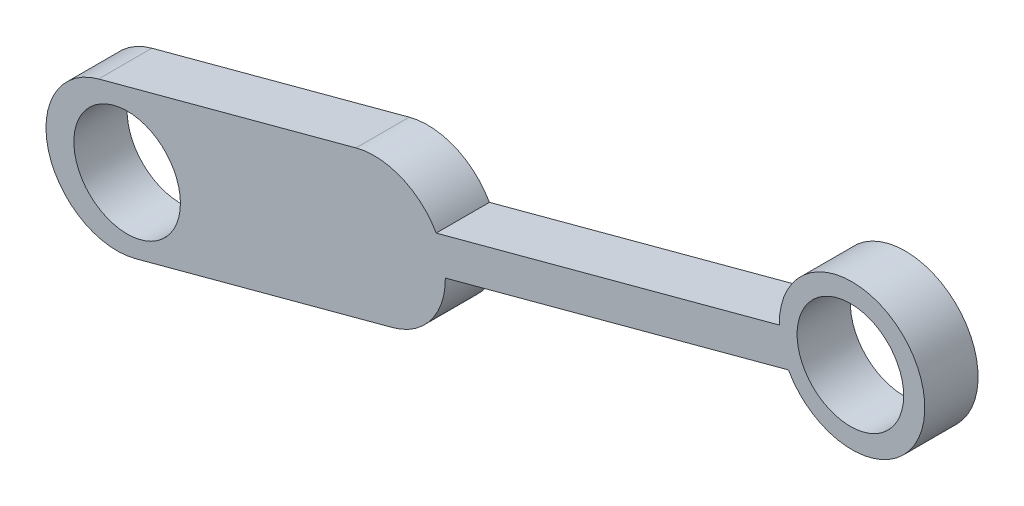
ISO-10303-21;
HEADER;
FILE_DESCRIPTION(('STEP AP214'),'2;1');
FILE_NAME('part.step','',(''),(''),'','','');
FILE_SCHEMA(('AUTOMOTIVE_DESIGN { 1 0 10303 214 1 1 1 1 }'));
ENDSEC;
DATA;
#1=APPLICATION_CONTEXT('core data for automotive mechanical design processes');
#2=APPLICATION_PROTOCOL_DEFINITION('international standard','automotive_design',2000,#1);
#3=PRODUCT_CONTEXT('',#1,'mechanical');
#4=PRODUCT('Part','Part','',(#3));
#5=PRODUCT_RELATED_PRODUCT_CATEGORY('part','',(#4));
#6=PRODUCT_DEFINITION_FORMATION('','',#4);
#7=PRODUCT_DEFINITION_CONTEXT('part definition',#1,'design');
#8=PRODUCT_DEFINITION('design','',#6,#7);
#9=PRODUCT_DEFINITION_SHAPE('','',#8);
#10=(LENGTH_UNIT() NAMED_UNIT(*) SI_UNIT(.MILLI.,.METRE.));
#11=(NAMED_UNIT(*) PLANE_ANGLE_UNIT() SI_UNIT($,.RADIAN.));
#12=(NAMED_UNIT(*) SI_UNIT($,.STERADIAN.) SOLID_ANGLE_UNIT());
#13=UNCERTAINTY_MEASURE_WITH_UNIT(LENGTH_MEASURE(1.E-05),#10,'distance_accuracy_value','');
#14=(GEOMETRIC_REPRESENTATION_CONTEXT(3) GLOBAL_UNCERTAINTY_ASSIGNED_CONTEXT((#13)) GLOBAL_UNIT_ASSIGNED_CONTEXT((#10,
#11,#12)) REPRESENTATION_CONTEXT('',''));
#15=CARTESIAN_POINT('',(0.,0.,0.));
#16=DIRECTION('',(0.,0.,1.));
#17=DIRECTION('',(1.,0.,0.));
#18=AXIS2_PLACEMENT_3D('',#15,#16,#17);
#19=CARTESIAN_POINT('',(-111.320079247921,34.3042255189022,3.));
#20=DIRECTION('',(-0.258819045102522,0.965925826289068,0.));
#21=DIRECTION('',(-0.965925826289068,-0.258819045102522,0.));
#22=AXIS2_PLACEMENT_3D('',#19,#20,#21);
#23=PLANE('',#22);
#24=DIRECTION('',(0.965925826289068,0.258819045102522,0.));
#25=VECTOR('',#24,1.);
#26=CARTESIAN_POINT('',(-111.320079247921,34.3042255189022,0.));
#27=LINE('',#26,#25);
#28=CARTESIAN_POINT('',(-111.320079247921,34.3042255189022,0.));
#29=VERTEX_POINT('',#28);
#30=CARTESIAN_POINT('',(-92.0015627221402,39.4806064209526,0.));
#31=VERTEX_POINT('',#30);
#32=EDGE_CURVE('E128',#29,#31,#27,.T.);
#33=ORIENTED_EDGE('',*,*,#32,.T.);
#34=DIRECTION('',(0.,0.,-1.));
#35=VECTOR('',#34,1.);
#36=CARTESIAN_POINT('',(-92.0015627221402,39.4806064209526,3.));
#37=LINE('',#36,#35);
#38=CARTESIAN_POINT('',(-92.0015627221402,39.4806064209526,3.));
#39=VERTEX_POINT('',#38);
#40=EDGE_CURVE('E11',#39,#31,#37,.T.);
#41=ORIENTED_EDGE('',*,*,#40,.F.);
#42=DIRECTION('',(0.965925826289068,0.258819045102522,0.));
#43=VECTOR('',#42,1.);
#44=CARTESIAN_POINT('',(-111.320079247921,34.3042255189022,3.));
#45=LINE('',#44,#43);
#46=CARTESIAN_POINT('',(-111.320079247921,34.3042255189022,3.));
#47=VERTEX_POINT('',#46);
#48=EDGE_CURVE('E147',#47,#39,#45,.T.);
#49=ORIENTED_EDGE('',*,*,#48,.F.);
#50=DIRECTION('',(0.,0.,-1.));
#51=VECTOR('',#50,1.);
#52=CARTESIAN_POINT('',(-111.320079247921,34.3042255189022,3.));
#53=LINE('',#52,#51);
#54=EDGE_CURVE('E124',#47,#29,#53,.T.);
#55=ORIENTED_EDGE('',*,*,#54,.T.);
#56=EDGE_LOOP('',(#33,#41,#49,#55));
#57=FACE_BOUND('',#56,.T.);
#58=ADVANCED_FACE('F33',(#57),#23,.F.);
#59=CARTESIAN_POINT('',(-88.4217741135421,41.4750840681107,3.));
#60=DIRECTION('',(0.,0.,-1.));
#61=DIRECTION('',(-1.,0.,0.));
#62=AXIS2_PLACEMENT_3D('',#59,#60,#61);
#63=CYLINDRICAL_SURFACE('',#62,4.09790526577442);
#64=CARTESIAN_POINT('',(-88.4217741135421,41.4750840681107,0.));
#65=DIRECTION('',(0.,0.,1.));
#66=DIRECTION('',(1.,0.,0.));
#67=AXIS2_PLACEMENT_3D('',#64,#65,#66);
#68=CIRCLE('',#67,4.09790526577442);
#69=CARTESIAN_POINT('',(-92.5192008123452,41.4124580735308,0.));
#70=VERTEX_POINT('',#69);
#71=EDGE_CURVE('E131',#31,#70,#68,.T.);
#72=ORIENTED_EDGE('',*,*,#71,.T.);
#73=DIRECTION('',(0.,0.,-1.));
#74=VECTOR('',#73,1.);
#75=CARTESIAN_POINT('',(-92.5192008123452,41.4124580735308,3.));
#76=LINE('',#75,#74);
#77=CARTESIAN_POINT('',(-92.5192008123452,41.4124580735308,3.));
#78=VERTEX_POINT('',#77);
#79=EDGE_CURVE('E41',#78,#70,#76,.T.);
#80=ORIENTED_EDGE('',*,*,#79,.F.);
#81=CARTESIAN_POINT('',(-88.4217741135421,41.4750840681107,3.));
#82=DIRECTION('',(0.,0.,1.));
#83=DIRECTION('',(1.,0.,0.));
#84=AXIS2_PLACEMENT_3D('',#81,#82,#83);
#85=CIRCLE('',#84,4.09790526577442);
#86=EDGE_CURVE('E92',#39,#78,#85,.T.);
#87=ORIENTED_EDGE('',*,*,#86,.F.);
#88=ORIENTED_EDGE('',*,*,#40,.T.);
#89=EDGE_LOOP('',(#72,#80,#87,#88));
#90=FACE_BOUND('',#89,.T.);
#91=ADVANCED_FACE('F160',(#90),#63,.T.);
#92=CARTESIAN_POINT('',(-111.837717338127,36.2360771714804,3.));
#93=DIRECTION('',(-0.258819045102521,0.965925826289068,0.));
#94=DIRECTION('',(-0.965925826289068,-0.258819045102521,0.));
#95=AXIS2_PLACEMENT_3D('',#92,#93,#94);
#96=PLANE('',#95);
#97=DIRECTION('',(0.965925826289068,0.258819045102521,0.));
#98=VECTOR('',#97,1.);
#99=CARTESIAN_POINT('',(-111.837717338127,36.2360771714804,0.));
#100=LINE('',#99,#98);
#101=CARTESIAN_POINT('',(-111.837717338127,36.2360771714804,0.));
#102=VERTEX_POINT('',#101);
#103=EDGE_CURVE('E135',#102,#70,#100,.T.);
#104=ORIENTED_EDGE('',*,*,#103,.F.);
#105=DIRECTION('',(0.,0.,-1.));
#106=VECTOR('',#105,1.);
#107=CARTESIAN_POINT('',(-111.837717338127,36.2360771714804,3.));
#108=LINE('',#107,#106);
#109=CARTESIAN_POINT('',(-111.837717338127,36.2360771714804,3.));
#110=VERTEX_POINT('',#109);
#111=EDGE_CURVE('E153',#110,#102,#108,.T.);
#112=ORIENTED_EDGE('',*,*,#111,.F.);
#113=DIRECTION('',(0.965925826289068,0.258819045102521,0.));
#114=VECTOR('',#113,1.);
#115=CARTESIAN_POINT('',(-111.837717338127,36.2360771714804,3.));
#116=LINE('',#115,#114);
#117=EDGE_CURVE('E159',#110,#78,#116,.T.);
#118=ORIENTED_EDGE('',*,*,#117,.T.);
#119=ORIENTED_EDGE('',*,*,#79,.T.);
#120=EDGE_LOOP('',(#104,#112,#118,#119));
#121=FACE_BOUND('',#120,.T.);
#122=ADVANCED_FACE('F157',(#121),#96,.T.);
#123=CARTESIAN_POINT('',(-115.319912931913,34.2677494938279,3.));
#124=DIRECTION('',(0.,0.,-1.));
#125=DIRECTION('',(-1.,0.,0.));
#126=AXIS2_PLACEMENT_3D('',#123,#124,#125);
#127=CYLINDRICAL_SURFACE('',#126,4.);
#128=CARTESIAN_POINT('',(-115.319912931913,34.2677494938279,0.));
#129=DIRECTION('',(0.,0.,1.));
#130=DIRECTION('',(1.,0.,0.));
#131=AXIS2_PLACEMENT_3D('',#128,#129,#130);
#132=CIRCLE('',#131,4.);
#133=CARTESIAN_POINT('',(-116.355189112323,38.1314527989842,0.));
#134=VERTEX_POINT('',#133);
#135=EDGE_CURVE('E138',#102,#134,#132,.T.);
#136=ORIENTED_EDGE('',*,*,#135,.T.);
#137=DIRECTION('',(0.,0.,-1.));
#138=VECTOR('',#137,1.);
#139=CARTESIAN_POINT('',(-116.355189112323,38.1314527989842,3.));
#140=LINE('',#139,#138);
#141=CARTESIAN_POINT('',(-116.355189112323,38.1314527989842,3.));
#142=VERTEX_POINT('',#141);
#143=EDGE_CURVE('E151',#142,#134,#140,.T.);
#144=ORIENTED_EDGE('',*,*,#143,.F.);
#145=CARTESIAN_POINT('',(-115.319912931913,34.2677494938279,3.));
#146=DIRECTION('',(0.,0.,1.));
#147=DIRECTION('',(1.,0.,0.));
#148=AXIS2_PLACEMENT_3D('',#145,#146,#147);
#149=CIRCLE('',#148,4.);
#150=EDGE_CURVE('E171',#110,#142,#149,.T.);
#151=ORIENTED_EDGE('',*,*,#150,.F.);
#152=ORIENTED_EDGE('',*,*,#111,.T.);
#153=EDGE_LOOP('',(#136,#144,#151,#152));
#154=FACE_BOUND('',#153,.T.);
#155=ADVANCED_FACE('F169',(#154),#127,.T.);
#156=CARTESIAN_POINT('',(-130.844076506659,34.2491671224463,3.));
#157=DIRECTION('',(-0.258819045102522,0.965925826289068,0.));
#158=DIRECTION('',(-0.965925826289068,-0.258819045102522,0.));
#159=AXIS2_PLACEMENT_3D('',#156,#157,#158);
#160=PLANE('',#159);
#161=DIRECTION('',(0.965925826289068,0.258819045102522,0.));
#162=VECTOR('',#161,1.);
#163=CARTESIAN_POINT('',(-130.844076506659,34.2491671224463,0.));
#164=LINE('',#163,#162);
#165=CARTESIAN_POINT('',(-130.844076506659,34.2491671224463,0.));
#166=VERTEX_POINT('',#165);
#167=EDGE_CURVE('E141',#166,#134,#164,.T.);
#168=ORIENTED_EDGE('',*,*,#167,.F.);
#169=DIRECTION('',(0.,0.,-1.));
#170=VECTOR('',#169,1.);
#171=CARTESIAN_POINT('',(-130.844076506659,34.2491671224463,3.));
#172=LINE('',#171,#170);
#173=CARTESIAN_POINT('',(-130.844076506659,34.2491671224463,3.));
#174=VERTEX_POINT('',#173);
#175=EDGE_CURVE('E119',#174,#166,#172,.T.);
#176=ORIENTED_EDGE('',*,*,#175,.F.);
#177=DIRECTION('',(0.965925826289068,0.258819045102522,0.));
#178=VECTOR('',#177,1.);
#179=CARTESIAN_POINT('',(-130.844076506659,34.2491671224463,3.));
#180=LINE('',#179,#178);
#181=EDGE_CURVE('E112',#174,#142,#180,.T.);
#182=ORIENTED_EDGE('',*,*,#181,.T.);
#183=ORIENTED_EDGE('',*,*,#143,.T.);
#184=EDGE_LOOP('',(#168,#176,#182,#183));
#185=FACE_BOUND('',#184,.T.);
#186=ADVANCED_FACE('F177',(#185),#160,.T.);
#187=CARTESIAN_POINT('',(-129.808800326249,30.38546381729,3.));
#188=DIRECTION('',(0.,0.,-1.));
#189=DIRECTION('',(-1.,0.,0.));
#190=AXIS2_PLACEMENT_3D('',#187,#188,#189);
#191=CYLINDRICAL_SURFACE('',#190,4.00000000000001);
#192=CARTESIAN_POINT('',(-129.808800326249,30.38546381729,0.));
#193=DIRECTION('',(0.,0.,1.));
#194=DIRECTION('',(1.,0.,0.));
#195=AXIS2_PLACEMENT_3D('',#192,#193,#194);
#196=CIRCLE('',#195,4.00000000000001);
#197=CARTESIAN_POINT('',(-128.773524145839,26.5217605121337,0.));
#198=VERTEX_POINT('',#197);
#199=EDGE_CURVE('E118',#166,#198,#196,.T.);
#200=ORIENTED_EDGE('',*,*,#199,.T.);
#201=DIRECTION('',(0.,0.,-1.));
#202=VECTOR('',#201,1.);
#203=CARTESIAN_POINT('',(-128.773524145839,26.5217605121337,3.));
#204=LINE('',#203,#202);
#205=CARTESIAN_POINT('',(-128.773524145839,26.5217605121337,3.));
#206=VERTEX_POINT('',#205);
#207=EDGE_CURVE('E115',#206,#198,#204,.T.);
#208=ORIENTED_EDGE('',*,*,#207,.F.);
#209=CARTESIAN_POINT('',(-129.808800326249,30.38546381729,3.));
#210=DIRECTION('',(0.,0.,1.));
#211=DIRECTION('',(1.,0.,0.));
#212=AXIS2_PLACEMENT_3D('',#209,#210,#211);
#213=CIRCLE('',#212,4.00000000000001);
#214=EDGE_CURVE('E106',#174,#206,#213,.T.);
#215=ORIENTED_EDGE('',*,*,#214,.F.);
#216=ORIENTED_EDGE('',*,*,#175,.T.);
#217=EDGE_LOOP('',(#200,#208,#215,#216));
#218=FACE_BOUND('',#217,.T.);
#219=ADVANCED_FACE('F116',(#218),#191,.T.);
#220=CARTESIAN_POINT('',(-128.773524145839,26.5217605121338,3.));
#221=DIRECTION('',(-0.258819045102519,0.965925826289069,0.));
#222=DIRECTION('',(-0.965925826289069,-0.258819045102519,0.));
#223=AXIS2_PLACEMENT_3D('',#220,#221,#222);
#224=PLANE('',#223);
#225=DIRECTION('',(0.965925826289069,0.258819045102519,0.));
#226=VECTOR('',#225,1.);
#227=CARTESIAN_POINT('',(-128.773524145839,26.5217605121338,0.));
#228=LINE('',#227,#226);
#229=CARTESIAN_POINT('',(-114.284636751503,30.4040461886716,0.));
#230=VERTEX_POINT('',#229);
#231=EDGE_CURVE('E78',#198,#230,#228,.T.);
#232=ORIENTED_EDGE('',*,*,#231,.T.);
#233=DIRECTION('',(0.,0.,-1.));
#234=VECTOR('',#233,1.);
#235=CARTESIAN_POINT('',(-114.284636751503,30.4040461886716,3.));
#236=LINE('',#235,#234);
#237=CARTESIAN_POINT('',(-114.284636751503,30.4040461886716,3.));
#238=VERTEX_POINT('',#237);
#239=EDGE_CURVE('E120',#238,#230,#236,.T.);
#240=ORIENTED_EDGE('',*,*,#239,.F.);
#241=DIRECTION('',(0.965925826289069,0.258819045102519,0.));
#242=VECTOR('',#241,1.);
#243=CARTESIAN_POINT('',(-128.773524145839,26.5217605121338,3.));
#244=LINE('',#243,#242);
#245=EDGE_CURVE('E110',#206,#238,#244,.T.);
#246=ORIENTED_EDGE('',*,*,#245,.F.);
#247=ORIENTED_EDGE('',*,*,#207,.T.);
#248=EDGE_LOOP('',(#232,#240,#246,#247));
#249=FACE_BOUND('',#248,.T.);
#250=ADVANCED_FACE('F122',(#249),#224,.F.);
#251=CARTESIAN_POINT('',(-115.319912931913,34.2677494938279,3.));
#252=DIRECTION('',(0.,0.,-1.));
#253=DIRECTION('',(-1.,0.,0.));
#254=AXIS2_PLACEMENT_3D('',#251,#252,#253);
#255=CYLINDRICAL_SURFACE('',#254,4.00000000000002);
#256=CARTESIAN_POINT('',(-115.319912931913,34.2677494938279,0.));
#257=DIRECTION('',(0.,0.,1.));
#258=DIRECTION('',(1.,0.,0.));
#259=AXIS2_PLACEMENT_3D('',#256,#257,#258);
#260=CIRCLE('',#259,4.00000000000002);
#261=EDGE_CURVE('E84',#230,#29,#260,.T.);
#262=ORIENTED_EDGE('',*,*,#261,.T.);
#263=ORIENTED_EDGE('',*,*,#54,.F.);
#264=CARTESIAN_POINT('',(-115.319912931913,34.2677494938279,3.));
#265=DIRECTION('',(0.,0.,1.));
#266=DIRECTION('',(1.,0.,0.));
#267=AXIS2_PLACEMENT_3D('',#264,#265,#266);
#268=CIRCLE('',#267,4.00000000000002);
#269=EDGE_CURVE('E49',#238,#47,#268,.T.);
#270=ORIENTED_EDGE('',*,*,#269,.F.);
#271=ORIENTED_EDGE('',*,*,#239,.T.);
#272=EDGE_LOOP('',(#262,#263,#270,#271));
#273=FACE_BOUND('',#272,.T.);
#274=ADVANCED_FACE('F180',(#273),#255,.T.);
#275=CARTESIAN_POINT('',(-88.4217741135421,41.4750840681107,3.));
#276=DIRECTION('',(0.,0.,1.));
#277=DIRECTION('',(1.,0.,0.));
#278=AXIS2_PLACEMENT_3D('',#275,#276,#277);
#279=PLANE('',#278);
#280=CARTESIAN_POINT('',(-88.5146209500989,41.46869745492,3.));
#281=DIRECTION('',(0.,0.,1.));
#282=DIRECTION('',(1.,0.,0.));
#283=AXIS2_PLACEMENT_3D('',#280,#281,#282);
#284=CIRCLE('',#283,3.00000000000001);
#285=CARTESIAN_POINT('',(-85.5146209500989,41.46869745492,3.));
#286=VERTEX_POINT('',#285);
#287=EDGE_CURVE('E260',#286,#286,#284,.T.);
#288=ORIENTED_EDGE('',*,*,#287,.F.);
#289=EDGE_LOOP('',(#288));
#290=FACE_BOUND('',#289,.T.);
#291=CARTESIAN_POINT('',(-129.239464025343,30.4897556962552,3.));
#292=DIRECTION('',(0.,0.,1.));
#293=DIRECTION('',(1.,0.,0.));
#294=AXIS2_PLACEMENT_3D('',#291,#292,#293);
#295=CIRCLE('',#294,2.99999999999999);
#296=CARTESIAN_POINT('',(-126.239464025343,30.4897556962552,3.));
#297=VERTEX_POINT('',#296);
#298=EDGE_CURVE('E265',#297,#297,#295,.T.);
#299=ORIENTED_EDGE('',*,*,#298,.F.);
#300=EDGE_LOOP('',(#299));
#301=FACE_BOUND('',#300,.T.);
#302=ORIENTED_EDGE('',*,*,#48,.T.);
#303=ORIENTED_EDGE('',*,*,#86,.T.);
#304=ORIENTED_EDGE('',*,*,#117,.F.);
#305=ORIENTED_EDGE('',*,*,#150,.T.);
#306=ORIENTED_EDGE('',*,*,#181,.F.);
#307=ORIENTED_EDGE('',*,*,#214,.T.);
#308=ORIENTED_EDGE('',*,*,#245,.T.);
#309=ORIENTED_EDGE('',*,*,#269,.T.);
#310=EDGE_LOOP('',(#302,#303,#304,#305,#306,#307,#308,#309));
#311=FACE_BOUND('',#310,.T.);
#312=ADVANCED_FACE('F108',(#290,#301,#311),#279,.T.);
#313=CARTESIAN_POINT('',(-88.4217741135421,41.4750840681107,0.));
#314=DIRECTION('',(0.,0.,1.));
#315=DIRECTION('',(1.,0.,0.));
#316=AXIS2_PLACEMENT_3D('',#313,#314,#315);
#317=PLANE('',#316);
#318=CARTESIAN_POINT('',(-88.5146209500989,41.46869745492,0.));
#319=DIRECTION('',(0.,0.,1.));
#320=DIRECTION('',(1.,0.,0.));
#321=AXIS2_PLACEMENT_3D('',#318,#319,#320);
#322=CIRCLE('',#321,3.00000000000001);
#323=CARTESIAN_POINT('',(-85.5146209500989,41.46869745492,0.));
#324=VERTEX_POINT('',#323);
#325=EDGE_CURVE('E132',#324,#324,#322,.T.);
#326=ORIENTED_EDGE('',*,*,#325,.T.);
#327=EDGE_LOOP('',(#326));
#328=FACE_BOUND('',#327,.T.);
#329=CARTESIAN_POINT('',(-129.239464025343,30.4897556962552,0.));
#330=DIRECTION('',(0.,0.,1.));
#331=DIRECTION('',(1.,0.,0.));
#332=AXIS2_PLACEMENT_3D('',#329,#330,#331);
#333=CIRCLE('',#332,2.99999999999999);
#334=CARTESIAN_POINT('',(-126.239464025343,30.4897556962552,0.));
#335=VERTEX_POINT('',#334);
#336=EDGE_CURVE('E261',#335,#335,#333,.T.);
#337=ORIENTED_EDGE('',*,*,#336,.T.);
#338=EDGE_LOOP('',(#337));
#339=FACE_BOUND('',#338,.T.);
#340=ORIENTED_EDGE('',*,*,#32,.F.);
#341=ORIENTED_EDGE('',*,*,#261,.F.);
#342=ORIENTED_EDGE('',*,*,#231,.F.);
#343=ORIENTED_EDGE('',*,*,#199,.F.);
#344=ORIENTED_EDGE('',*,*,#167,.T.);
#345=ORIENTED_EDGE('',*,*,#135,.F.);
#346=ORIENTED_EDGE('',*,*,#103,.T.);
#347=ORIENTED_EDGE('',*,*,#71,.F.);
#348=EDGE_LOOP('',(#340,#341,#342,#343,#344,#345,#346,#347));
#349=FACE_BOUND('',#348,.T.);
#350=ADVANCED_FACE('F165',(#328,#339,#349),#317,.F.);
#351=CARTESIAN_POINT('',(-129.239464025343,30.4897556962552,0.));
#352=DIRECTION('',(0.,0.,1.));
#353=DIRECTION('',(1.,0.,0.));
#354=AXIS2_PLACEMENT_3D('',#351,#352,#353);
#355=CYLINDRICAL_SURFACE('',#354,2.99999999999999);
#356=ORIENTED_EDGE('',*,*,#336,.F.);
#357=EDGE_LOOP('',(#356));
#358=FACE_BOUND('',#357,.T.);
#359=ORIENTED_EDGE('',*,*,#298,.T.);
#360=EDGE_LOOP('',(#359));
#361=FACE_BOUND('',#360,.T.);
#362=ADVANCED_FACE('F232',(#358,#361),#355,.F.);
#363=CARTESIAN_POINT('',(-88.5146209500989,41.46869745492,0.));
#364=DIRECTION('',(0.,0.,1.));
#365=DIRECTION('',(1.,0.,0.));
#366=AXIS2_PLACEMENT_3D('',#363,#364,#365);
#367=CYLINDRICAL_SURFACE('',#366,3.00000000000001);
#368=ORIENTED_EDGE('',*,*,#325,.F.);
#369=EDGE_LOOP('',(#368));
#370=FACE_BOUND('',#369,.T.);
#371=ORIENTED_EDGE('',*,*,#287,.T.);
#372=EDGE_LOOP('',(#371));
#373=FACE_BOUND('',#372,.T.);
#374=ADVANCED_FACE('F241',(#370,#373),#367,.F.);
#375=CLOSED_SHELL('',(#58,#91,#122,#155,#186,#219,#250,#274,#312,#350,#362,#374));
#376=MANIFOLD_SOLID_BREP('B2',#375);
#377=ADVANCED_BREP_SHAPE_REPRESENTATION('',(#18,#376),#14);
#378=SHAPE_DEFINITION_REPRESENTATION(#9,#377);
ENDSEC;
END-ISO-10303-21;
